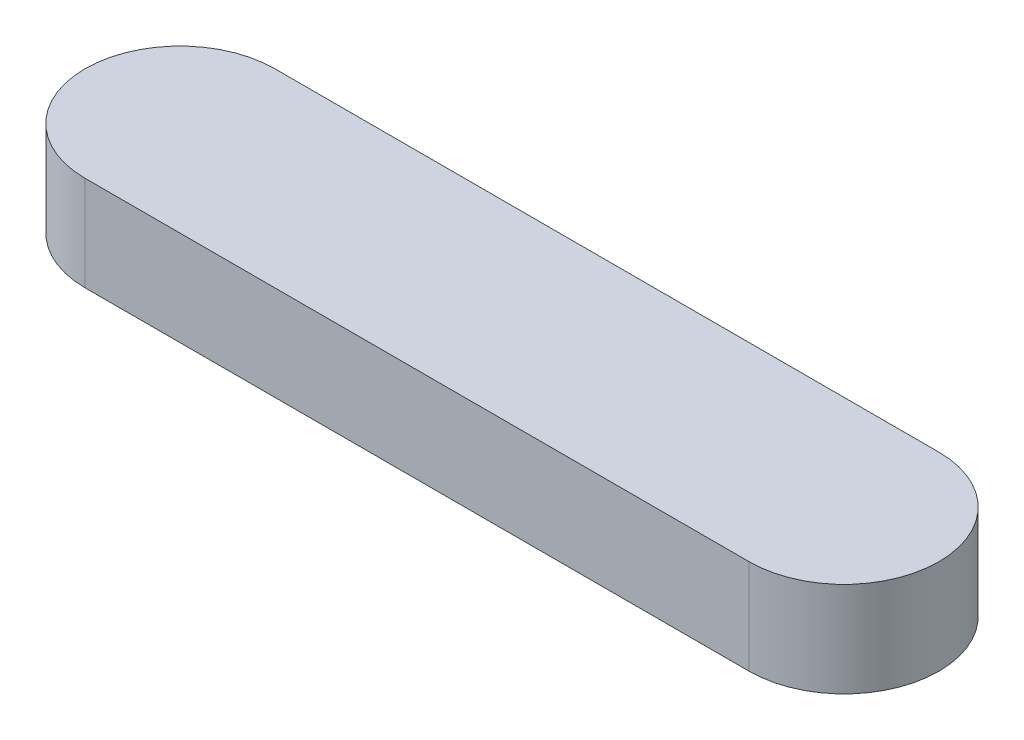
ISO-10303-21;
HEADER;
FILE_DESCRIPTION(('STEP AP214'),'2;1');
FILE_NAME('part.step','',(''),(''),'','','');
FILE_SCHEMA(('AUTOMOTIVE_DESIGN { 1 0 10303 214 1 1 1 1 }'));
ENDSEC;
DATA;
#1=APPLICATION_CONTEXT('core data for automotive mechanical design processes');
#2=APPLICATION_PROTOCOL_DEFINITION('international standard','automotive_design',2000,#1);
#3=PRODUCT_CONTEXT('',#1,'mechanical');
#4=PRODUCT('Part','Part','',(#3));
#5=PRODUCT_RELATED_PRODUCT_CATEGORY('part','',(#4));
#6=PRODUCT_DEFINITION_FORMATION('','',#4);
#7=PRODUCT_DEFINITION_CONTEXT('part definition',#1,'design');
#8=PRODUCT_DEFINITION('design','',#6,#7);
#9=PRODUCT_DEFINITION_SHAPE('','',#8);
#10=(LENGTH_UNIT() NAMED_UNIT(*) SI_UNIT(.MILLI.,.METRE.));
#11=(NAMED_UNIT(*) PLANE_ANGLE_UNIT() SI_UNIT($,.RADIAN.));
#12=(NAMED_UNIT(*) SI_UNIT($,.STERADIAN.) SOLID_ANGLE_UNIT());
#13=UNCERTAINTY_MEASURE_WITH_UNIT(LENGTH_MEASURE(1.E-05),#10,'distance_accuracy_value','');
#14=(GEOMETRIC_REPRESENTATION_CONTEXT(3) GLOBAL_UNCERTAINTY_ASSIGNED_CONTEXT((#13)) GLOBAL_UNIT_ASSIGNED_CONTEXT((#10,
#11,#12)) REPRESENTATION_CONTEXT('',''));
#15=CARTESIAN_POINT('',(0.,0.,0.));
#16=DIRECTION('',(0.,0.,1.));
#17=DIRECTION('',(1.,0.,0.));
#18=AXIS2_PLACEMENT_3D('',#15,#16,#17);
#19=CARTESIAN_POINT('',(-114.3,25.4,0.));
#20=DIRECTION('',(0.,-1.,0.));
#21=DIRECTION('',(0.,0.,-1.));
#22=AXIS2_PLACEMENT_3D('',#19,#20,#21);
#23=CYLINDRICAL_SURFACE('',#22,25.4);
#24=CARTESIAN_POINT('',(-114.3,0.,0.));
#25=DIRECTION('',(0.,1.,0.));
#26=DIRECTION('',(0.,0.,1.));
#27=AXIS2_PLACEMENT_3D('',#24,#25,#26);
#28=CIRCLE('',#27,25.4);
#29=CARTESIAN_POINT('',(-114.3,0.,-25.4));
#30=VERTEX_POINT('',#29);
#31=CARTESIAN_POINT('',(-114.3,0.,25.4));
#32=VERTEX_POINT('',#31);
#33=EDGE_CURVE('E96',#30,#32,#28,.T.);
#34=ORIENTED_EDGE('',*,*,#33,.T.);
#35=DIRECTION('',(0.,-1.,0.));
#36=VECTOR('',#35,1.);
#37=CARTESIAN_POINT('',(-114.3,25.4,25.4));
#38=LINE('',#37,#36);
#39=CARTESIAN_POINT('',(-114.3,25.4,25.4));
#40=VERTEX_POINT('',#39);
#41=EDGE_CURVE('E11',#40,#32,#38,.T.);
#42=ORIENTED_EDGE('',*,*,#41,.F.);
#43=CARTESIAN_POINT('',(-114.3,25.4,0.));
#44=DIRECTION('',(0.,1.,0.));
#45=DIRECTION('',(0.,0.,1.));
#46=AXIS2_PLACEMENT_3D('',#43,#44,#45);
#47=CIRCLE('',#46,25.4);
#48=CARTESIAN_POINT('',(-114.3,25.4,-25.4));
#49=VERTEX_POINT('',#48);
#50=EDGE_CURVE('E84',#49,#40,#47,.T.);
#51=ORIENTED_EDGE('',*,*,#50,.F.);
#52=DIRECTION('',(0.,-1.,0.));
#53=VECTOR('',#52,1.);
#54=CARTESIAN_POINT('',(-114.3,25.4,-25.4));
#55=LINE('',#54,#53);
#56=EDGE_CURVE('E92',#49,#30,#55,.T.);
#57=ORIENTED_EDGE('',*,*,#56,.T.);
#58=EDGE_LOOP('',(#34,#42,#51,#57));
#59=FACE_BOUND('',#58,.T.);
#60=ADVANCED_FACE('F33',(#59),#23,.T.);
#61=CARTESIAN_POINT('',(-114.3,25.4,25.4));
#62=DIRECTION('',(0.,0.,-1.));
#63=DIRECTION('',(-1.,0.,0.));
#64=AXIS2_PLACEMENT_3D('',#61,#62,#63);
#65=PLANE('',#64);
#66=DIRECTION('',(1.,0.,0.));
#67=VECTOR('',#66,1.);
#68=CARTESIAN_POINT('',(-114.3,0.,25.4));
#69=LINE('',#68,#67);
#70=CARTESIAN_POINT('',(63.5,0.,25.4));
#71=VERTEX_POINT('',#70);
#72=EDGE_CURVE('E88',#32,#71,#69,.T.);
#73=ORIENTED_EDGE('',*,*,#72,.T.);
#74=DIRECTION('',(0.,-1.,0.));
#75=VECTOR('',#74,1.);
#76=CARTESIAN_POINT('',(63.5,25.4,25.4));
#77=LINE('',#76,#75);
#78=CARTESIAN_POINT('',(63.5,25.4,25.4));
#79=VERTEX_POINT('',#78);
#80=EDGE_CURVE('E41',#79,#71,#77,.T.);
#81=ORIENTED_EDGE('',*,*,#80,.F.);
#82=DIRECTION('',(1.,0.,0.));
#83=VECTOR('',#82,1.);
#84=CARTESIAN_POINT('',(-114.3,25.4,25.4));
#85=LINE('',#84,#83);
#86=EDGE_CURVE('E79',#40,#79,#85,.T.);
#87=ORIENTED_EDGE('',*,*,#86,.F.);
#88=ORIENTED_EDGE('',*,*,#41,.T.);
#89=EDGE_LOOP('',(#73,#81,#87,#88));
#90=FACE_BOUND('',#89,.T.);
#91=ADVANCED_FACE('F87',(#90),#65,.F.);
#92=CARTESIAN_POINT('',(63.5,25.4,0.));
#93=DIRECTION('',(0.,-1.,0.));
#94=DIRECTION('',(0.,0.,-1.));
#95=AXIS2_PLACEMENT_3D('',#92,#93,#94);
#96=CYLINDRICAL_SURFACE('',#95,25.4);
#97=CARTESIAN_POINT('',(63.5,0.,0.));
#98=DIRECTION('',(0.,1.,0.));
#99=DIRECTION('',(0.,0.,-1.));
#100=AXIS2_PLACEMENT_3D('',#97,#98,#99);
#101=CIRCLE('',#100,25.4);
#102=CARTESIAN_POINT('',(63.5,0.,-25.4));
#103=VERTEX_POINT('',#102);
#104=EDGE_CURVE('E66',#71,#103,#101,.T.);
#105=ORIENTED_EDGE('',*,*,#104,.T.);
#106=DIRECTION('',(0.,-1.,0.));
#107=VECTOR('',#106,1.);
#108=CARTESIAN_POINT('',(63.5,25.4,-25.4));
#109=LINE('',#108,#107);
#110=CARTESIAN_POINT('',(63.5,25.4,-25.4));
#111=VERTEX_POINT('',#110);
#112=EDGE_CURVE('E89',#111,#103,#109,.T.);
#113=ORIENTED_EDGE('',*,*,#112,.F.);
#114=CARTESIAN_POINT('',(63.5,25.4,0.));
#115=DIRECTION('',(0.,1.,0.));
#116=DIRECTION('',(0.,0.,-1.));
#117=AXIS2_PLACEMENT_3D('',#114,#115,#116);
#118=CIRCLE('',#117,25.4);
#119=EDGE_CURVE('E82',#79,#111,#118,.T.);
#120=ORIENTED_EDGE('',*,*,#119,.F.);
#121=ORIENTED_EDGE('',*,*,#80,.T.);
#122=EDGE_LOOP('',(#105,#113,#120,#121));
#123=FACE_BOUND('',#122,.T.);
#124=ADVANCED_FACE('F90',(#123),#96,.T.);
#125=CARTESIAN_POINT('',(-114.3,25.4,-25.4));
#126=DIRECTION('',(0.,0.,1.));
#127=DIRECTION('',(1.,0.,0.));
#128=AXIS2_PLACEMENT_3D('',#125,#126,#127);
#129=PLANE('',#128);
#130=DIRECTION('',(-1.,0.,0.));
#131=VECTOR('',#130,1.);
#132=CARTESIAN_POINT('',(-114.3,0.,-25.4));
#133=LINE('',#132,#131);
#134=EDGE_CURVE('E72',#103,#30,#133,.T.);
#135=ORIENTED_EDGE('',*,*,#134,.T.);
#136=ORIENTED_EDGE('',*,*,#56,.F.);
#137=DIRECTION('',(-1.,0.,0.));
#138=VECTOR('',#137,1.);
#139=CARTESIAN_POINT('',(-114.3,25.4,-25.4));
#140=LINE('',#139,#138);
#141=EDGE_CURVE('E49',#111,#49,#140,.T.);
#142=ORIENTED_EDGE('',*,*,#141,.F.);
#143=ORIENTED_EDGE('',*,*,#112,.T.);
#144=EDGE_LOOP('',(#135,#136,#142,#143));
#145=FACE_BOUND('',#144,.T.);
#146=ADVANCED_FACE('F103',(#145),#129,.F.);
#147=CARTESIAN_POINT('',(-114.3,25.4,0.));
#148=DIRECTION('',(0.,1.,0.));
#149=DIRECTION('',(0.,0.,1.));
#150=AXIS2_PLACEMENT_3D('',#147,#148,#149);
#151=PLANE('',#150);
#152=ORIENTED_EDGE('',*,*,#50,.T.);
#153=ORIENTED_EDGE('',*,*,#86,.T.);
#154=ORIENTED_EDGE('',*,*,#119,.T.);
#155=ORIENTED_EDGE('',*,*,#141,.T.);
#156=EDGE_LOOP('',(#152,#153,#154,#155));
#157=FACE_BOUND('',#156,.T.);
#158=ADVANCED_FACE('F80',(#157),#151,.T.);
#159=CARTESIAN_POINT('',(-114.3,0.,0.));
#160=DIRECTION('',(0.,1.,0.));
#161=DIRECTION('',(0.,0.,1.));
#162=AXIS2_PLACEMENT_3D('',#159,#160,#161);
#163=PLANE('',#162);
#164=ORIENTED_EDGE('',*,*,#33,.F.);
#165=ORIENTED_EDGE('',*,*,#134,.F.);
#166=ORIENTED_EDGE('',*,*,#104,.F.);
#167=ORIENTED_EDGE('',*,*,#72,.F.);
#168=EDGE_LOOP('',(#164,#165,#166,#167));
#169=FACE_BOUND('',#168,.T.);
#170=ADVANCED_FACE('F106',(#169),#163,.F.);
#171=CLOSED_SHELL('',(#60,#91,#124,#146,#158,#170));
#172=MANIFOLD_SOLID_BREP('B2',#171);
#173=ADVANCED_BREP_SHAPE_REPRESENTATION('',(#18,#172),#14);
#174=SHAPE_DEFINITION_REPRESENTATION(#9,#173);
ENDSEC;
END-ISO-10303-21;
